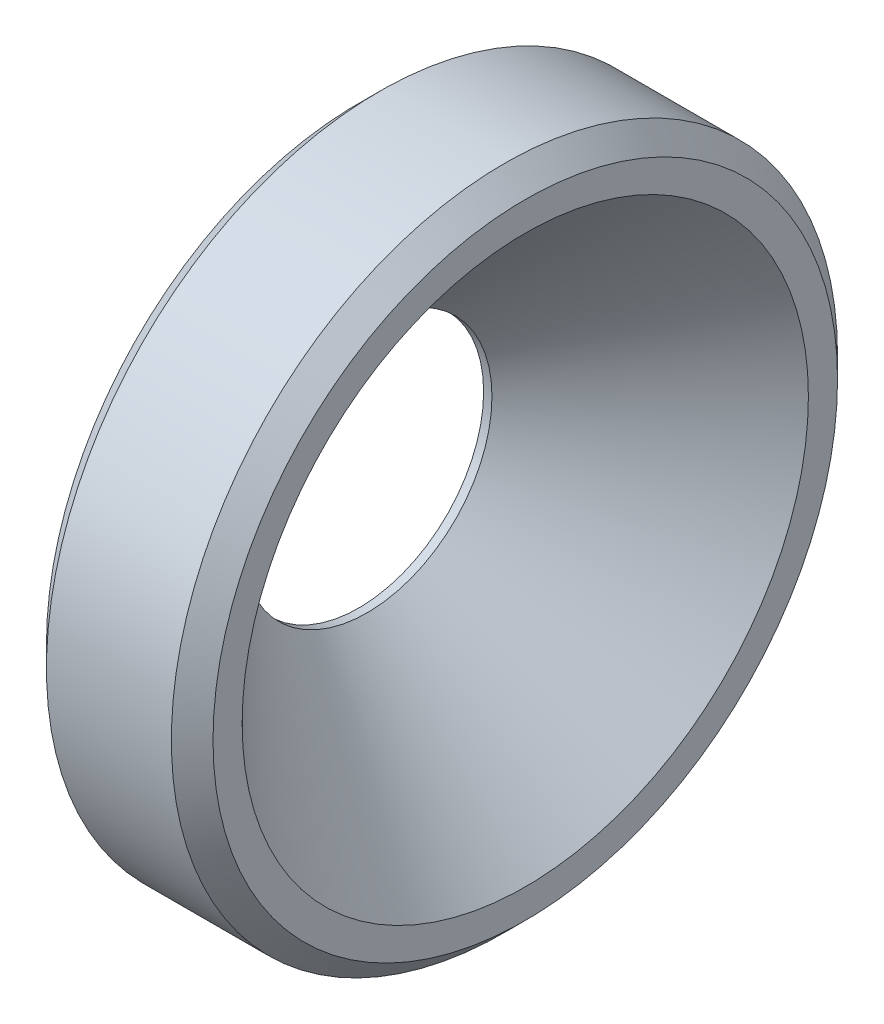
ISO-10303-21;
HEADER;
FILE_DESCRIPTION(('STEP AP214'),'2;1');
FILE_NAME('part.step','',(''),(''),'','','');
FILE_SCHEMA(('AUTOMOTIVE_DESIGN { 1 0 10303 214 1 1 1 1 }'));
ENDSEC;
DATA;
#1=APPLICATION_CONTEXT('core data for automotive mechanical design processes');
#2=APPLICATION_PROTOCOL_DEFINITION('international standard','automotive_design',2000,#1);
#3=PRODUCT_CONTEXT('',#1,'mechanical');
#4=PRODUCT('Part','Part','',(#3));
#5=PRODUCT_RELATED_PRODUCT_CATEGORY('part','',(#4));
#6=PRODUCT_DEFINITION_FORMATION('','',#4);
#7=PRODUCT_DEFINITION_CONTEXT('part definition',#1,'design');
#8=PRODUCT_DEFINITION('design','',#6,#7);
#9=PRODUCT_DEFINITION_SHAPE('','',#8);
#10=(LENGTH_UNIT() NAMED_UNIT(*) SI_UNIT(.MILLI.,.METRE.));
#11=(NAMED_UNIT(*) PLANE_ANGLE_UNIT() SI_UNIT($,.RADIAN.));
#12=(NAMED_UNIT(*) SI_UNIT($,.STERADIAN.) SOLID_ANGLE_UNIT());
#13=UNCERTAINTY_MEASURE_WITH_UNIT(LENGTH_MEASURE(1.E-05),#10,'distance_accuracy_value','');
#14=(GEOMETRIC_REPRESENTATION_CONTEXT(3) GLOBAL_UNCERTAINTY_ASSIGNED_CONTEXT((#13)) GLOBAL_UNIT_ASSIGNED_CONTEXT((#10,
#11,#12)) REPRESENTATION_CONTEXT('',''));
#15=CARTESIAN_POINT('',(0.,0.,0.));
#16=DIRECTION('',(0.,0.,1.));
#17=DIRECTION('',(1.,0.,0.));
#18=AXIS2_PLACEMENT_3D('',#15,#16,#17);
#19=CARTESIAN_POINT('',(2.,0.,0.));
#20=DIRECTION('',(1.,0.,0.));
#21=DIRECTION('',(0.,0.,-1.));
#22=AXIS2_PLACEMENT_3D('',#19,#20,#21);
#23=PLANE('',#22);
#24=CARTESIAN_POINT('',(2.,0.,0.));
#25=DIRECTION('',(1.,0.,0.));
#26=DIRECTION('',(0.,0.,-1.));
#27=AXIS2_PLACEMENT_3D('',#24,#25,#26);
#28=CIRCLE('',#27,3.75);
#29=CARTESIAN_POINT('',(2.,0.,-3.75));
#30=VERTEX_POINT('',#29);
#31=EDGE_CURVE('E50',#30,#30,#28,.T.);
#32=ORIENTED_EDGE('',*,*,#31,.T.);
#33=EDGE_LOOP('',(#32));
#34=FACE_BOUND('',#33,.T.);
#35=CARTESIAN_POINT('',(2.,0.,0.));
#36=DIRECTION('',(1.,0.,0.));
#37=DIRECTION('',(0.,0.,-1.));
#38=AXIS2_PLACEMENT_3D('',#35,#36,#37);
#39=CIRCLE('',#38,3.4);
#40=CARTESIAN_POINT('',(2.,0.,-3.4));
#41=VERTEX_POINT('',#40);
#42=EDGE_CURVE('E55',#41,#41,#39,.F.);
#43=ORIENTED_EDGE('',*,*,#42,.T.);
#44=EDGE_LOOP('',(#43));
#45=FACE_BOUND('',#44,.T.);
#46=ADVANCED_FACE('F34',(#34,#45),#23,.T.);
#47=CARTESIAN_POINT('',(0.,0.,0.));
#48=DIRECTION('',(1.,0.,0.));
#49=DIRECTION('',(0.,0.,-1.));
#50=AXIS2_PLACEMENT_3D('',#47,#48,#49);
#51=PLANE('',#50);
#52=CARTESIAN_POINT('',(0.,0.,0.));
#53=DIRECTION('',(1.,0.,0.));
#54=DIRECTION('',(0.,0.,-1.));
#55=AXIS2_PLACEMENT_3D('',#52,#53,#54);
#56=CIRCLE('',#55,3.75);
#57=CARTESIAN_POINT('',(0.,0.,-3.75));
#58=VERTEX_POINT('',#57);
#59=EDGE_CURVE('E10',#58,#58,#56,.F.);
#60=ORIENTED_EDGE('',*,*,#59,.T.);
#61=EDGE_LOOP('',(#60));
#62=FACE_BOUND('',#61,.T.);
#63=CARTESIAN_POINT('',(0.,0.,0.));
#64=DIRECTION('',(1.,0.,0.));
#65=DIRECTION('',(0.,0.,-1.));
#66=AXIS2_PLACEMENT_3D('',#63,#64,#65);
#67=CIRCLE('',#66,1.5);
#68=CARTESIAN_POINT('',(0.,0.,-1.5));
#69=VERTEX_POINT('',#68);
#70=EDGE_CURVE('E61',#69,#69,#67,.T.);
#71=ORIENTED_EDGE('',*,*,#70,.T.);
#72=EDGE_LOOP('',(#71));
#73=FACE_BOUND('',#72,.T.);
#74=ADVANCED_FACE('F65',(#62,#73),#51,.F.);
#75=CARTESIAN_POINT('',(2.,0.,0.));
#76=DIRECTION('',(-1.,0.,0.));
#77=DIRECTION('',(0.,0.,1.));
#78=AXIS2_PLACEMENT_3D('',#75,#76,#77);
#79=CYLINDRICAL_SURFACE('',#78,4.);
#80=CARTESIAN_POINT('',(1.75,0.,0.));
#81=DIRECTION('',(1.,0.,0.));
#82=DIRECTION('',(0.,0.,-1.));
#83=AXIS2_PLACEMENT_3D('',#80,#81,#82);
#84=CIRCLE('',#83,4.);
#85=CARTESIAN_POINT('',(1.75,0.,-4.));
#86=VERTEX_POINT('',#85);
#87=EDGE_CURVE('E42',#86,#86,#84,.F.);
#88=ORIENTED_EDGE('',*,*,#87,.T.);
#89=EDGE_LOOP('',(#88));
#90=FACE_BOUND('',#89,.T.);
#91=CARTESIAN_POINT('',(0.250000000000001,0.,0.));
#92=DIRECTION('',(1.,0.,0.));
#93=DIRECTION('',(0.,0.,-1.));
#94=AXIS2_PLACEMENT_3D('',#91,#92,#93);
#95=CIRCLE('',#94,4.);
#96=CARTESIAN_POINT('',(0.250000000000001,0.,-4.));
#97=VERTEX_POINT('',#96);
#98=EDGE_CURVE('E46',#97,#97,#95,.T.);
#99=ORIENTED_EDGE('',*,*,#98,.T.);
#100=EDGE_LOOP('',(#99));
#101=FACE_BOUND('',#100,.T.);
#102=ADVANCED_FACE('F70',(#90,#101),#79,.T.);
#103=CARTESIAN_POINT('',(2.,0.,0.));
#104=DIRECTION('',(-1.,0.,0.));
#105=DIRECTION('',(0.,0.,1.));
#106=AXIS2_PLACEMENT_3D('',#103,#104,#105);
#107=CYLINDRICAL_SURFACE('',#106,1.5);
#108=CARTESIAN_POINT('',(0.0999999999999944,0.,0.));
#109=DIRECTION('',(1.,0.,0.));
#110=DIRECTION('',(0.,0.,-1.));
#111=AXIS2_PLACEMENT_3D('',#108,#109,#110);
#112=CIRCLE('',#111,1.5);
#113=CARTESIAN_POINT('',(0.0999999999999944,0.,-1.5));
#114=VERTEX_POINT('',#113);
#115=EDGE_CURVE('E58',#114,#114,#112,.T.);
#116=ORIENTED_EDGE('',*,*,#115,.T.);
#117=EDGE_LOOP('',(#116));
#118=FACE_BOUND('',#117,.T.);
#119=ORIENTED_EDGE('',*,*,#70,.F.);
#120=EDGE_LOOP('',(#119));
#121=FACE_BOUND('',#120,.T.);
#122=ADVANCED_FACE('F67',(#118,#121),#107,.F.);
#123=CARTESIAN_POINT('',(0.0999999999999944,0.,0.));
#124=DIRECTION('',(1.,0.,0.));
#125=DIRECTION('',(0.,0.,-1.));
#126=AXIS2_PLACEMENT_3D('',#123,#124,#125);
#127=CONICAL_SURFACE('',#126,1.5,0.785398163397446);
#128=ORIENTED_EDGE('',*,*,#42,.F.);
#129=EDGE_LOOP('',(#128));
#130=FACE_BOUND('',#129,.T.);
#131=ORIENTED_EDGE('',*,*,#115,.F.);
#132=EDGE_LOOP('',(#131));
#133=FACE_BOUND('',#132,.T.);
#134=ADVANCED_FACE('F69',(#130,#133),#127,.F.);
#135=CARTESIAN_POINT('',(2.,0.,0.));
#136=DIRECTION('',(-1.,0.,0.));
#137=DIRECTION('',(0.,0.,1.));
#138=AXIS2_PLACEMENT_3D('',#135,#136,#137);
#139=CONICAL_SURFACE('',#138,3.75,0.785398163397448);
#140=ORIENTED_EDGE('',*,*,#87,.F.);
#141=EDGE_LOOP('',(#140));
#142=FACE_BOUND('',#141,.T.);
#143=ORIENTED_EDGE('',*,*,#31,.F.);
#144=EDGE_LOOP('',(#143));
#145=FACE_BOUND('',#144,.T.);
#146=ADVANCED_FACE('F77',(#142,#145),#139,.T.);
#147=CARTESIAN_POINT('',(0.250000000000001,0.,0.));
#148=DIRECTION('',(1.,0.,0.));
#149=DIRECTION('',(0.,0.,-1.));
#150=AXIS2_PLACEMENT_3D('',#147,#148,#149);
#151=CONICAL_SURFACE('',#150,4.,0.785398163397452);
#152=ORIENTED_EDGE('',*,*,#59,.F.);
#153=EDGE_LOOP('',(#152));
#154=FACE_BOUND('',#153,.T.);
#155=ORIENTED_EDGE('',*,*,#98,.F.);
#156=EDGE_LOOP('',(#155));
#157=FACE_BOUND('',#156,.T.);
#158=ADVANCED_FACE('F37',(#154,#157),#151,.T.);
#159=CLOSED_SHELL('',(#46,#74,#102,#122,#134,#146,#158));
#160=MANIFOLD_SOLID_BREP('B2',#159);
#161=ADVANCED_BREP_SHAPE_REPRESENTATION('',(#18,#160),#14);
#162=SHAPE_DEFINITION_REPRESENTATION(#9,#161);
ENDSEC;
END-ISO-10303-21;
